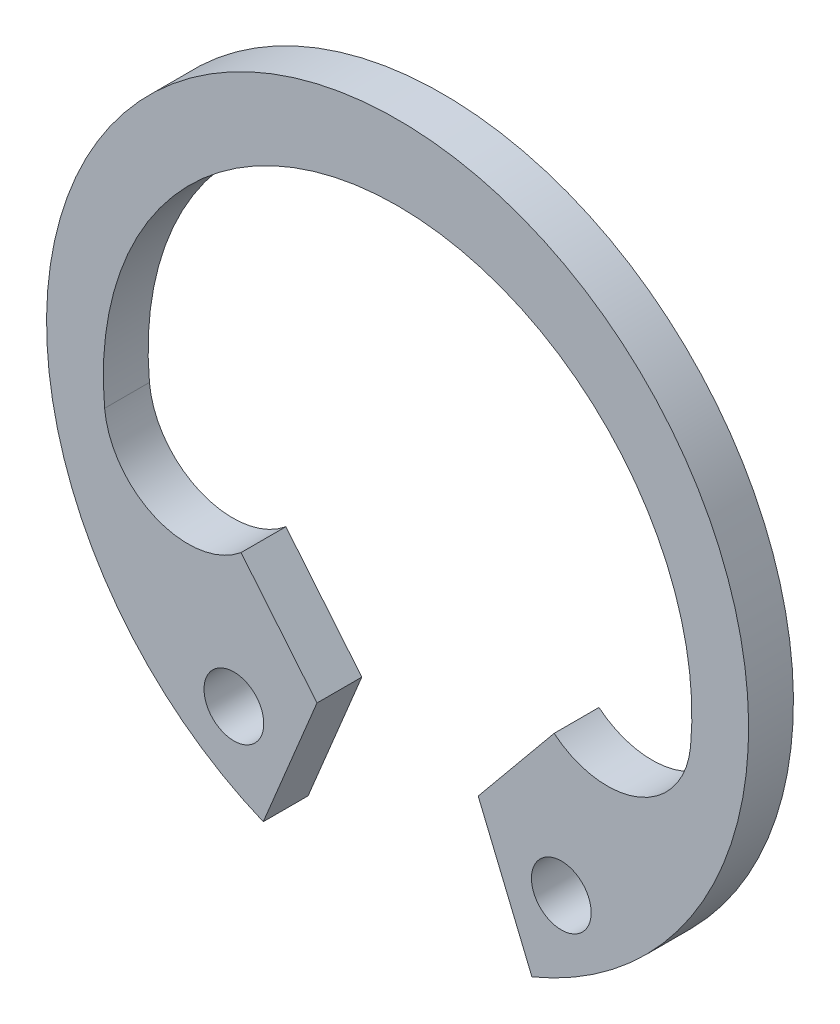
ISO-10303-21;
HEADER;
FILE_DESCRIPTION(('STEP AP214'),'2;1');
FILE_NAME('part.step','',(''),(''),'','','');
FILE_SCHEMA(('AUTOMOTIVE_DESIGN { 1 0 10303 214 1 1 1 1 }'));
ENDSEC;
DATA;
#1=APPLICATION_CONTEXT('core data for automotive mechanical design processes');
#2=APPLICATION_PROTOCOL_DEFINITION('international standard','automotive_design',2000,#1);
#3=PRODUCT_CONTEXT('',#1,'mechanical');
#4=PRODUCT('Part','Part','',(#3));
#5=PRODUCT_RELATED_PRODUCT_CATEGORY('part','',(#4));
#6=PRODUCT_DEFINITION_FORMATION('','',#4);
#7=PRODUCT_DEFINITION_CONTEXT('part definition',#1,'design');
#8=PRODUCT_DEFINITION('design','',#6,#7);
#9=PRODUCT_DEFINITION_SHAPE('','',#8);
#10=(LENGTH_UNIT() NAMED_UNIT(*) SI_UNIT(.MILLI.,.METRE.));
#11=(NAMED_UNIT(*) PLANE_ANGLE_UNIT() SI_UNIT($,.RADIAN.));
#12=(NAMED_UNIT(*) SI_UNIT($,.STERADIAN.) SOLID_ANGLE_UNIT());
#13=UNCERTAINTY_MEASURE_WITH_UNIT(LENGTH_MEASURE(1.E-05),#10,'distance_accuracy_value','');
#14=(GEOMETRIC_REPRESENTATION_CONTEXT(3) GLOBAL_UNCERTAINTY_ASSIGNED_CONTEXT((#13)) GLOBAL_UNIT_ASSIGNED_CONTEXT((#10,
#11,#12)) REPRESENTATION_CONTEXT('',''));
#15=CARTESIAN_POINT('',(0.,0.,0.));
#16=DIRECTION('',(0.,0.,1.));
#17=DIRECTION('',(1.,0.,0.));
#18=AXIS2_PLACEMENT_3D('',#15,#16,#17);
#19=CARTESIAN_POINT('',(0.,0.,1.5));
#20=DIRECTION('',(0.,0.,1.));
#21=DIRECTION('',(1.,0.,0.));
#22=AXIS2_PLACEMENT_3D('',#19,#20,#21);
#23=PLANE('',#22);
#24=CARTESIAN_POINT('',(-5.48002764560022,-8.00370520468222,1.5));
#25=DIRECTION('',(0.,0.,1.));
#26=DIRECTION('',(1.,0.,0.));
#27=AXIS2_PLACEMENT_3D('',#24,#25,#26);
#28=CIRCLE('',#27,1.);
#29=CARTESIAN_POINT('',(-4.48002764560022,-8.00370520468222,1.5));
#30=VERTEX_POINT('',#29);
#31=EDGE_CURVE('E138',#30,#30,#28,.T.);
#32=ORIENTED_EDGE('',*,*,#31,.F.);
#33=EDGE_LOOP('',(#32));
#34=FACE_BOUND('',#33,.T.);
#35=CARTESIAN_POINT('',(0.,0.,1.5));
#36=DIRECTION('',(0.,0.,1.));
#37=DIRECTION('',(1.,0.,0.));
#38=AXIS2_PLACEMENT_3D('',#35,#36,#37);
#39=CIRCLE('',#38,11.75);
#40=CARTESIAN_POINT('',(4.49653033028973,-10.8555845070076,1.5));
#41=VERTEX_POINT('',#40);
#42=CARTESIAN_POINT('',(-4.49653033028973,-10.8555845070076,1.5));
#43=VERTEX_POINT('',#42);
#44=EDGE_CURVE('E149',#41,#43,#39,.T.);
#45=ORIENTED_EDGE('',*,*,#44,.T.);
#46=DIRECTION('',(0.382683432365084,0.923879532511289,0.));
#47=VECTOR('',#46,1.);
#48=CARTESIAN_POINT('',(-2.69791819817384,-6.51335070420458,1.5));
#49=LINE('',#48,#47);
#50=CARTESIAN_POINT('',(-2.69791819817384,-6.51335070420458,1.5));
#51=VERTEX_POINT('',#50);
#52=EDGE_CURVE('E96',#43,#51,#49,.T.);
#53=ORIENTED_EDGE('',*,*,#52,.T.);
#54=DIRECTION('',(-0.635422404360472,0.772164728562991,0.));
#55=VECTOR('',#54,1.);
#56=CARTESIAN_POINT('',(-5.23960781561572,-3.42469178995262,1.5));
#57=LINE('',#56,#55);
#58=CARTESIAN_POINT('',(-5.23960781561572,-3.42469178995262,1.5));
#59=VERTEX_POINT('',#58);
#60=EDGE_CURVE('E164',#51,#59,#57,.T.);
#61=ORIENTED_EDGE('',*,*,#60,.T.);
#62=CARTESIAN_POINT('',(-7.01879054782504,-1.26263054997624,1.5));
#63=DIRECTION('',(0.,0.,-1.));
#64=DIRECTION('',(1.,0.,0.));
#65=AXIS2_PLACEMENT_3D('',#62,#63,#64);
#66=CIRCLE('',#65,2.8);
#67=CARTESIAN_POINT('',(-9.80639530440804,-1.52580296698808,1.5));
#68=VERTEX_POINT('',#67);
#69=EDGE_CURVE('E178',#59,#68,#66,.T.);
#70=ORIENTED_EDGE('',*,*,#69,.T.);
#71=CARTESIAN_POINT('',(0.,-0.6,1.5));
#72=DIRECTION('',(0.,0.,-1.));
#73=DIRECTION('',(1.,0.,0.));
#74=AXIS2_PLACEMENT_3D('',#71,#72,#73);
#75=CIRCLE('',#74,9.85);
#76=CARTESIAN_POINT('',(9.80639530440804,-1.52580296698808,1.5));
#77=VERTEX_POINT('',#76);
#78=EDGE_CURVE('E115',#68,#77,#75,.T.);
#79=ORIENTED_EDGE('',*,*,#78,.T.);
#80=CARTESIAN_POINT('',(7.01879054782504,-1.26263054997624,1.5));
#81=DIRECTION('',(0.,0.,-1.));
#82=DIRECTION('',(-1.,0.,0.));
#83=AXIS2_PLACEMENT_3D('',#80,#81,#82);
#84=CIRCLE('',#83,2.8);
#85=CARTESIAN_POINT('',(5.23960781561572,-3.42469178995262,1.5));
#86=VERTEX_POINT('',#85);
#87=EDGE_CURVE('E109',#77,#86,#84,.T.);
#88=ORIENTED_EDGE('',*,*,#87,.T.);
#89=DIRECTION('',(-0.635422404360472,-0.772164728562991,0.));
#90=VECTOR('',#89,1.);
#91=CARTESIAN_POINT('',(5.23960781561572,-3.42469178995262,1.5));
#92=LINE('',#91,#90);
#93=CARTESIAN_POINT('',(2.69791819817384,-6.51335070420458,1.5));
#94=VERTEX_POINT('',#93);
#95=EDGE_CURVE('E113',#86,#94,#92,.T.);
#96=ORIENTED_EDGE('',*,*,#95,.T.);
#97=DIRECTION('',(0.382683432365084,-0.923879532511289,0.));
#98=VECTOR('',#97,1.);
#99=CARTESIAN_POINT('',(2.69791819817384,-6.51335070420458,1.5));
#100=LINE('',#99,#98);
#101=EDGE_CURVE('E53',#94,#41,#100,.T.);
#102=ORIENTED_EDGE('',*,*,#101,.T.);
#103=EDGE_LOOP('',(#45,#53,#61,#70,#79,#88,#96,#102));
#104=FACE_BOUND('',#103,.T.);
#105=CARTESIAN_POINT('',(5.48002764560022,-8.00370520468222,1.5));
#106=DIRECTION('',(0.,0.,1.));
#107=DIRECTION('',(-1.,0.,0.));
#108=AXIS2_PLACEMENT_3D('',#105,#106,#107);
#109=CIRCLE('',#108,1.);
#110=CARTESIAN_POINT('',(4.48002764560022,-8.00370520468222,1.5));
#111=VERTEX_POINT('',#110);
#112=EDGE_CURVE('E189',#111,#111,#109,.T.);
#113=ORIENTED_EDGE('',*,*,#112,.F.);
#114=EDGE_LOOP('',(#113));
#115=FACE_BOUND('',#114,.T.);
#116=ADVANCED_FACE('F36',(#34,#104,#115),#23,.T.);
#117=CARTESIAN_POINT('',(0.,0.,0.));
#118=DIRECTION('',(0.,0.,1.));
#119=DIRECTION('',(1.,0.,0.));
#120=AXIS2_PLACEMENT_3D('',#117,#118,#119);
#121=PLANE('',#120);
#122=CARTESIAN_POINT('',(0.,0.,0.));
#123=DIRECTION('',(0.,0.,1.));
#124=DIRECTION('',(1.,0.,0.));
#125=AXIS2_PLACEMENT_3D('',#122,#123,#124);
#126=CIRCLE('',#125,11.75);
#127=CARTESIAN_POINT('',(4.49653033028973,-10.8555845070076,0.));
#128=VERTEX_POINT('',#127);
#129=CARTESIAN_POINT('',(-4.49653033028973,-10.8555845070076,0.));
#130=VERTEX_POINT('',#129);
#131=EDGE_CURVE('E133',#128,#130,#126,.T.);
#132=ORIENTED_EDGE('',*,*,#131,.F.);
#133=DIRECTION('',(0.382683432365084,-0.923879532511289,0.));
#134=VECTOR('',#133,1.);
#135=CARTESIAN_POINT('',(2.69791819817384,-6.51335070420458,0.));
#136=LINE('',#135,#134);
#137=CARTESIAN_POINT('',(2.69791819817384,-6.51335070420458,0.));
#138=VERTEX_POINT('',#137);
#139=EDGE_CURVE('E88',#138,#128,#136,.T.);
#140=ORIENTED_EDGE('',*,*,#139,.F.);
#141=DIRECTION('',(-0.635422404360472,-0.772164728562991,0.));
#142=VECTOR('',#141,1.);
#143=CARTESIAN_POINT('',(5.23960781561572,-3.42469178995262,0.));
#144=LINE('',#143,#142);
#145=CARTESIAN_POINT('',(5.23960781561572,-3.42469178995262,0.));
#146=VERTEX_POINT('',#145);
#147=EDGE_CURVE('E82',#146,#138,#144,.T.);
#148=ORIENTED_EDGE('',*,*,#147,.F.);
#149=CARTESIAN_POINT('',(7.01879054782504,-1.26263054997624,0.));
#150=DIRECTION('',(0.,0.,-1.));
#151=DIRECTION('',(-1.,0.,0.));
#152=AXIS2_PLACEMENT_3D('',#149,#150,#151);
#153=CIRCLE('',#152,2.8);
#154=CARTESIAN_POINT('',(9.80639530440804,-1.52580296698808,0.));
#155=VERTEX_POINT('',#154);
#156=EDGE_CURVE('E123',#155,#146,#153,.T.);
#157=ORIENTED_EDGE('',*,*,#156,.F.);
#158=CARTESIAN_POINT('',(0.,-0.6,0.));
#159=DIRECTION('',(0.,0.,-1.));
#160=DIRECTION('',(1.,0.,0.));
#161=AXIS2_PLACEMENT_3D('',#158,#159,#160);
#162=CIRCLE('',#161,9.85);
#163=CARTESIAN_POINT('',(-9.80639530440804,-1.52580296698808,0.));
#164=VERTEX_POINT('',#163);
#165=EDGE_CURVE('E144',#164,#155,#162,.T.);
#166=ORIENTED_EDGE('',*,*,#165,.F.);
#167=CARTESIAN_POINT('',(-7.01879054782504,-1.26263054997624,0.));
#168=DIRECTION('',(0.,0.,-1.));
#169=DIRECTION('',(1.,0.,0.));
#170=AXIS2_PLACEMENT_3D('',#167,#168,#169);
#171=CIRCLE('',#170,2.8);
#172=CARTESIAN_POINT('',(-5.23960781561572,-3.42469178995262,0.));
#173=VERTEX_POINT('',#172);
#174=EDGE_CURVE('E142',#173,#164,#171,.T.);
#175=ORIENTED_EDGE('',*,*,#174,.F.);
#176=DIRECTION('',(-0.635422404360472,0.772164728562991,0.));
#177=VECTOR('',#176,1.);
#178=CARTESIAN_POINT('',(-5.23960781561572,-3.42469178995262,0.));
#179=LINE('',#178,#177);
#180=CARTESIAN_POINT('',(-2.69791819817384,-6.51335070420458,0.));
#181=VERTEX_POINT('',#180);
#182=EDGE_CURVE('E140',#181,#173,#179,.T.);
#183=ORIENTED_EDGE('',*,*,#182,.F.);
#184=DIRECTION('',(0.382683432365084,0.923879532511289,0.));
#185=VECTOR('',#184,1.);
#186=CARTESIAN_POINT('',(-2.69791819817384,-6.51335070420458,0.));
#187=LINE('',#186,#185);
#188=EDGE_CURVE('E137',#130,#181,#187,.T.);
#189=ORIENTED_EDGE('',*,*,#188,.F.);
#190=EDGE_LOOP('',(#132,#140,#148,#157,#166,#175,#183,#189));
#191=FACE_BOUND('',#190,.T.);
#192=CARTESIAN_POINT('',(-5.48002764560022,-8.00370520468222,0.));
#193=DIRECTION('',(0.,0.,1.));
#194=DIRECTION('',(1.,0.,0.));
#195=AXIS2_PLACEMENT_3D('',#192,#193,#194);
#196=CIRCLE('',#195,1.);
#197=CARTESIAN_POINT('',(-4.48002764560022,-8.00370520468222,0.));
#198=VERTEX_POINT('',#197);
#199=EDGE_CURVE('E186',#198,#198,#196,.T.);
#200=ORIENTED_EDGE('',*,*,#199,.T.);
#201=EDGE_LOOP('',(#200));
#202=FACE_BOUND('',#201,.T.);
#203=CARTESIAN_POINT('',(5.48002764560022,-8.00370520468222,0.));
#204=DIRECTION('',(0.,0.,1.));
#205=DIRECTION('',(-1.,0.,0.));
#206=AXIS2_PLACEMENT_3D('',#203,#204,#205);
#207=CIRCLE('',#206,1.);
#208=CARTESIAN_POINT('',(4.48002764560022,-8.00370520468222,0.));
#209=VERTEX_POINT('',#208);
#210=EDGE_CURVE('E192',#209,#209,#207,.T.);
#211=ORIENTED_EDGE('',*,*,#210,.T.);
#212=EDGE_LOOP('',(#211));
#213=FACE_BOUND('',#212,.T.);
#214=ADVANCED_FACE('F168',(#191,#202,#213),#121,.F.);
#215=CARTESIAN_POINT('',(0.,0.,1.5));
#216=DIRECTION('',(0.,0.,-1.));
#217=DIRECTION('',(-1.,0.,0.));
#218=AXIS2_PLACEMENT_3D('',#215,#216,#217);
#219=CYLINDRICAL_SURFACE('',#218,11.75);
#220=ORIENTED_EDGE('',*,*,#131,.T.);
#221=DIRECTION('',(0.,0.,-1.));
#222=VECTOR('',#221,1.);
#223=CARTESIAN_POINT('',(-4.49653033028973,-10.8555845070076,1.5));
#224=LINE('',#223,#222);
#225=EDGE_CURVE('E11',#43,#130,#224,.T.);
#226=ORIENTED_EDGE('',*,*,#225,.F.);
#227=ORIENTED_EDGE('',*,*,#44,.F.);
#228=DIRECTION('',(0.,0.,-1.));
#229=VECTOR('',#228,1.);
#230=CARTESIAN_POINT('',(4.49653033028973,-10.8555845070076,1.5));
#231=LINE('',#230,#229);
#232=EDGE_CURVE('E129',#41,#128,#231,.T.);
#233=ORIENTED_EDGE('',*,*,#232,.T.);
#234=EDGE_LOOP('',(#220,#226,#227,#233));
#235=FACE_BOUND('',#234,.T.);
#236=ADVANCED_FACE('F38',(#235),#219,.T.);
#237=CARTESIAN_POINT('',(-2.69791819817384,-6.51335070420458,1.5));
#238=DIRECTION('',(-0.923879532511289,0.382683432365084,0.));
#239=DIRECTION('',(-0.382683432365084,-0.923879532511289,0.));
#240=AXIS2_PLACEMENT_3D('',#237,#238,#239);
#241=PLANE('',#240);
#242=ORIENTED_EDGE('',*,*,#188,.T.);
#243=DIRECTION('',(0.,0.,-1.));
#244=VECTOR('',#243,1.);
#245=CARTESIAN_POINT('',(-2.69791819817384,-6.51335070420458,1.5));
#246=LINE('',#245,#244);
#247=EDGE_CURVE('E45',#51,#181,#246,.T.);
#248=ORIENTED_EDGE('',*,*,#247,.F.);
#249=ORIENTED_EDGE('',*,*,#52,.F.);
#250=ORIENTED_EDGE('',*,*,#225,.T.);
#251=EDGE_LOOP('',(#242,#248,#249,#250));
#252=FACE_BOUND('',#251,.T.);
#253=ADVANCED_FACE('F224',(#252),#241,.F.);
#254=CARTESIAN_POINT('',(-5.23960781561572,-3.42469178995262,1.5));
#255=DIRECTION('',(-0.772164728562991,-0.635422404360472,0.));
#256=DIRECTION('',(0.635422404360472,-0.772164728562991,0.));
#257=AXIS2_PLACEMENT_3D('',#254,#255,#256);
#258=PLANE('',#257);
#259=ORIENTED_EDGE('',*,*,#182,.T.);
#260=DIRECTION('',(0.,0.,-1.));
#261=VECTOR('',#260,1.);
#262=CARTESIAN_POINT('',(-5.23960781561572,-3.42469178995262,1.5));
#263=LINE('',#262,#261);
#264=EDGE_CURVE('E156',#59,#173,#263,.T.);
#265=ORIENTED_EDGE('',*,*,#264,.F.);
#266=ORIENTED_EDGE('',*,*,#60,.F.);
#267=ORIENTED_EDGE('',*,*,#247,.T.);
#268=EDGE_LOOP('',(#259,#265,#266,#267));
#269=FACE_BOUND('',#268,.T.);
#270=ADVANCED_FACE('F162',(#269),#258,.F.);
#271=CARTESIAN_POINT('',(-7.01879054782504,-1.26263054997624,1.5));
#272=DIRECTION('',(0.,0.,-1.));
#273=DIRECTION('',(-1.,0.,0.));
#274=AXIS2_PLACEMENT_3D('',#271,#272,#273);
#275=CYLINDRICAL_SURFACE('',#274,2.8);
#276=ORIENTED_EDGE('',*,*,#174,.T.);
#277=DIRECTION('',(0.,0.,-1.));
#278=VECTOR('',#277,1.);
#279=CARTESIAN_POINT('',(-9.80639530440804,-1.52580296698808,1.5));
#280=LINE('',#279,#278);
#281=EDGE_CURVE('E153',#68,#164,#280,.T.);
#282=ORIENTED_EDGE('',*,*,#281,.F.);
#283=ORIENTED_EDGE('',*,*,#69,.F.);
#284=ORIENTED_EDGE('',*,*,#264,.T.);
#285=EDGE_LOOP('',(#276,#282,#283,#284));
#286=FACE_BOUND('',#285,.T.);
#287=ADVANCED_FACE('F173',(#286),#275,.F.);
#288=CARTESIAN_POINT('',(0.,-0.6,1.5));
#289=DIRECTION('',(0.,0.,-1.));
#290=DIRECTION('',(-1.,0.,0.));
#291=AXIS2_PLACEMENT_3D('',#288,#289,#290);
#292=CYLINDRICAL_SURFACE('',#291,9.85);
#293=ORIENTED_EDGE('',*,*,#165,.T.);
#294=DIRECTION('',(0.,0.,-1.));
#295=VECTOR('',#294,1.);
#296=CARTESIAN_POINT('',(9.80639530440804,-1.52580296698808,1.5));
#297=LINE('',#296,#295);
#298=EDGE_CURVE('E124',#77,#155,#297,.T.);
#299=ORIENTED_EDGE('',*,*,#298,.F.);
#300=ORIENTED_EDGE('',*,*,#78,.F.);
#301=ORIENTED_EDGE('',*,*,#281,.T.);
#302=EDGE_LOOP('',(#293,#299,#300,#301));
#303=FACE_BOUND('',#302,.T.);
#304=ADVANCED_FACE('F176',(#303),#292,.F.);
#305=CARTESIAN_POINT('',(7.01879054782504,-1.26263054997624,1.5));
#306=DIRECTION('',(0.,0.,-1.));
#307=DIRECTION('',(-1.,0.,0.));
#308=AXIS2_PLACEMENT_3D('',#305,#306,#307);
#309=CYLINDRICAL_SURFACE('',#308,2.8);
#310=ORIENTED_EDGE('',*,*,#156,.T.);
#311=DIRECTION('',(0.,0.,-1.));
#312=VECTOR('',#311,1.);
#313=CARTESIAN_POINT('',(5.23960781561572,-3.42469178995262,1.5));
#314=LINE('',#313,#312);
#315=EDGE_CURVE('E120',#86,#146,#314,.T.);
#316=ORIENTED_EDGE('',*,*,#315,.F.);
#317=ORIENTED_EDGE('',*,*,#87,.F.);
#318=ORIENTED_EDGE('',*,*,#298,.T.);
#319=EDGE_LOOP('',(#310,#316,#317,#318));
#320=FACE_BOUND('',#319,.T.);
#321=ADVANCED_FACE('F121',(#320),#309,.F.);
#322=CARTESIAN_POINT('',(5.23960781561572,-3.42469178995262,1.5));
#323=DIRECTION('',(0.772164728562991,-0.635422404360472,0.));
#324=DIRECTION('',(0.635422404360472,0.772164728562991,0.));
#325=AXIS2_PLACEMENT_3D('',#322,#323,#324);
#326=PLANE('',#325);
#327=ORIENTED_EDGE('',*,*,#147,.T.);
#328=DIRECTION('',(0.,0.,-1.));
#329=VECTOR('',#328,1.);
#330=CARTESIAN_POINT('',(2.69791819817384,-6.51335070420458,1.5));
#331=LINE('',#330,#329);
#332=EDGE_CURVE('E125',#94,#138,#331,.T.);
#333=ORIENTED_EDGE('',*,*,#332,.F.);
#334=ORIENTED_EDGE('',*,*,#95,.F.);
#335=ORIENTED_EDGE('',*,*,#315,.T.);
#336=EDGE_LOOP('',(#327,#333,#334,#335));
#337=FACE_BOUND('',#336,.T.);
#338=ADVANCED_FACE('F127',(#337),#326,.F.);
#339=CARTESIAN_POINT('',(2.69791819817384,-6.51335070420458,1.5));
#340=DIRECTION('',(0.923879532511289,0.382683432365084,0.));
#341=DIRECTION('',(-0.382683432365084,0.923879532511289,0.));
#342=AXIS2_PLACEMENT_3D('',#339,#340,#341);
#343=PLANE('',#342);
#344=ORIENTED_EDGE('',*,*,#139,.T.);
#345=ORIENTED_EDGE('',*,*,#232,.F.);
#346=ORIENTED_EDGE('',*,*,#101,.F.);
#347=ORIENTED_EDGE('',*,*,#332,.T.);
#348=EDGE_LOOP('',(#344,#345,#346,#347));
#349=FACE_BOUND('',#348,.T.);
#350=ADVANCED_FACE('F212',(#349),#343,.F.);
#351=CARTESIAN_POINT('',(-5.48002764560022,-8.00370520468222,1.5));
#352=DIRECTION('',(0.,0.,-1.));
#353=DIRECTION('',(-1.,0.,0.));
#354=AXIS2_PLACEMENT_3D('',#351,#352,#353);
#355=CYLINDRICAL_SURFACE('',#354,1.);
#356=ORIENTED_EDGE('',*,*,#31,.T.);
#357=EDGE_LOOP('',(#356));
#358=FACE_BOUND('',#357,.T.);
#359=ORIENTED_EDGE('',*,*,#199,.F.);
#360=EDGE_LOOP('',(#359));
#361=FACE_BOUND('',#360,.T.);
#362=ADVANCED_FACE('F209',(#358,#361),#355,.F.);
#363=CARTESIAN_POINT('',(5.48002764560022,-8.00370520468222,1.5));
#364=DIRECTION('',(0.,0.,-1.));
#365=DIRECTION('',(-1.,0.,0.));
#366=AXIS2_PLACEMENT_3D('',#363,#364,#365);
#367=CYLINDRICAL_SURFACE('',#366,1.);
#368=ORIENTED_EDGE('',*,*,#112,.T.);
#369=EDGE_LOOP('',(#368));
#370=FACE_BOUND('',#369,.T.);
#371=ORIENTED_EDGE('',*,*,#210,.F.);
#372=EDGE_LOOP('',(#371));
#373=FACE_BOUND('',#372,.T.);
#374=ADVANCED_FACE('F198',(#370,#373),#367,.F.);
#375=CLOSED_SHELL('',(#116,#214,#236,#253,#270,#287,#304,#321,#338,#350,#362,#374));
#376=MANIFOLD_SOLID_BREP('B2',#375);
#377=ADVANCED_BREP_SHAPE_REPRESENTATION('',(#18,#376),#14);
#378=SHAPE_DEFINITION_REPRESENTATION(#9,#377);
ENDSEC;
END-ISO-10303-21;
